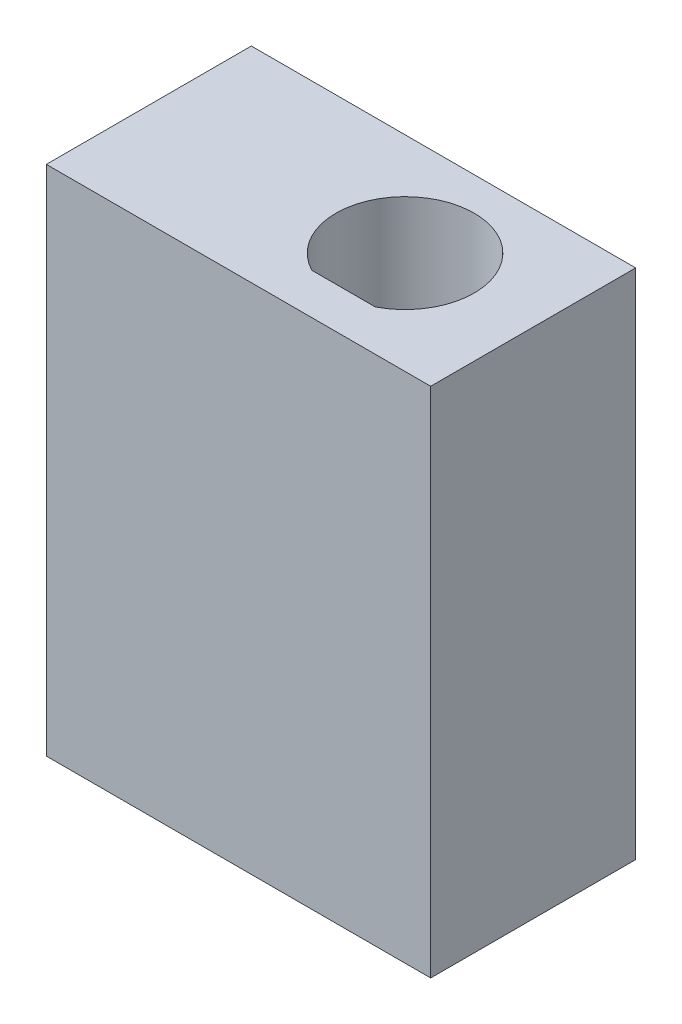
ISO-10303-21;
HEADER;
FILE_DESCRIPTION(('STEP AP214'),'2;1');
FILE_NAME('part.step','',(''),(''),'','','');
FILE_SCHEMA(('AUTOMOTIVE_DESIGN { 1 0 10303 214 1 1 1 1 }'));
ENDSEC;
DATA;
#1=APPLICATION_CONTEXT('core data for automotive mechanical design processes');
#2=APPLICATION_PROTOCOL_DEFINITION('international standard','automotive_design',2000,#1);
#3=PRODUCT_CONTEXT('',#1,'mechanical');
#4=PRODUCT('Part','Part','',(#3));
#5=PRODUCT_RELATED_PRODUCT_CATEGORY('part','',(#4));
#6=PRODUCT_DEFINITION_FORMATION('','',#4);
#7=PRODUCT_DEFINITION_CONTEXT('part definition',#1,'design');
#8=PRODUCT_DEFINITION('design','',#6,#7);
#9=PRODUCT_DEFINITION_SHAPE('','',#8);
#10=(LENGTH_UNIT() NAMED_UNIT(*) SI_UNIT(.MILLI.,.METRE.));
#11=(NAMED_UNIT(*) PLANE_ANGLE_UNIT() SI_UNIT($,.RADIAN.));
#12=(NAMED_UNIT(*) SI_UNIT($,.STERADIAN.) SOLID_ANGLE_UNIT());
#13=UNCERTAINTY_MEASURE_WITH_UNIT(LENGTH_MEASURE(1.E-05),#10,'distance_accuracy_value','');
#14=(GEOMETRIC_REPRESENTATION_CONTEXT(3) GLOBAL_UNCERTAINTY_ASSIGNED_CONTEXT((#13)) GLOBAL_UNIT_ASSIGNED_CONTEXT((#10,
#11,#12)) REPRESENTATION_CONTEXT('',''));
#15=CARTESIAN_POINT('',(0.,0.,0.));
#16=DIRECTION('',(0.,0.,1.));
#17=DIRECTION('',(1.,0.,0.));
#18=AXIS2_PLACEMENT_3D('',#15,#16,#17);
#19=CARTESIAN_POINT('',(0.,20.,0.));
#20=DIRECTION('',(0.,-1.,0.));
#21=DIRECTION('',(0.,0.,-1.));
#22=AXIS2_PLACEMENT_3D('',#19,#20,#21);
#23=PLANE('',#22);
#24=DIRECTION('',(0.,0.,1.));
#25=VECTOR('',#24,1.);
#26=CARTESIAN_POINT('',(0.,20.,0.));
#27=LINE('',#26,#25);
#28=CARTESIAN_POINT('',(0.,20.,-8.));
#29=VERTEX_POINT('',#28);
#30=CARTESIAN_POINT('',(0.,20.,0.));
#31=VERTEX_POINT('',#30);
#32=EDGE_CURVE('E115',#29,#31,#27,.T.);
#33=ORIENTED_EDGE('',*,*,#32,.T.);
#34=DIRECTION('',(1.,0.,0.));
#35=VECTOR('',#34,1.);
#36=CARTESIAN_POINT('',(0.,20.,0.));
#37=LINE('',#36,#35);
#38=CARTESIAN_POINT('',(15.,20.,0.));
#39=VERTEX_POINT('',#38);
#40=EDGE_CURVE('E119',#31,#39,#37,.T.);
#41=ORIENTED_EDGE('',*,*,#40,.T.);
#42=DIRECTION('',(0.,0.,-1.));
#43=VECTOR('',#42,1.);
#44=CARTESIAN_POINT('',(15.,20.,0.));
#45=LINE('',#44,#43);
#46=CARTESIAN_POINT('',(15.,20.,-8.));
#47=VERTEX_POINT('',#46);
#48=EDGE_CURVE('E123',#39,#47,#45,.T.);
#49=ORIENTED_EDGE('',*,*,#48,.T.);
#50=DIRECTION('',(-1.,0.,0.));
#51=VECTOR('',#50,1.);
#52=CARTESIAN_POINT('',(0.,20.,-8.));
#53=LINE('',#52,#51);
#54=EDGE_CURVE('E126',#47,#29,#53,.T.);
#55=ORIENTED_EDGE('',*,*,#54,.T.);
#56=EDGE_LOOP('',(#33,#41,#49,#55));
#57=FACE_BOUND('',#56,.T.);
#58=CARTESIAN_POINT('',(10.,20.,-4.));
#59=DIRECTION('',(0.,1.,0.));
#60=DIRECTION('',(0.,0.,1.));
#61=AXIS2_PLACEMENT_3D('',#58,#59,#60);
#62=CIRCLE('',#61,2.7);
#63=CARTESIAN_POINT('',(11.2369316876853,20.,-1.6));
#64=VERTEX_POINT('',#63);
#65=CARTESIAN_POINT('',(8.7630683123147,20.,-1.6));
#66=VERTEX_POINT('',#65);
#67=EDGE_CURVE('E99',#64,#66,#62,.T.);
#68=ORIENTED_EDGE('',*,*,#67,.F.);
#69=DIRECTION('',(1.,0.,0.));
#70=VECTOR('',#69,1.);
#71=CARTESIAN_POINT('',(8.7630683123147,20.,-1.6));
#72=LINE('',#71,#70);
#73=EDGE_CURVE('E92',#66,#64,#72,.T.);
#74=ORIENTED_EDGE('',*,*,#73,.F.);
#75=EDGE_LOOP('',(#68,#74));
#76=FACE_BOUND('',#75,.T.);
#77=ADVANCED_FACE('F39',(#57,#76),#23,.F.);
#78=CARTESIAN_POINT('',(0.,0.,0.));
#79=DIRECTION('',(0.,-1.,0.));
#80=DIRECTION('',(0.,0.,-1.));
#81=AXIS2_PLACEMENT_3D('',#78,#79,#80);
#82=PLANE('',#81);
#83=DIRECTION('',(0.,0.,1.));
#84=VECTOR('',#83,1.);
#85=CARTESIAN_POINT('',(0.,0.,0.));
#86=LINE('',#85,#84);
#87=CARTESIAN_POINT('',(0.,0.,-8.));
#88=VERTEX_POINT('',#87);
#89=CARTESIAN_POINT('',(0.,0.,0.));
#90=VERTEX_POINT('',#89);
#91=EDGE_CURVE('E114',#88,#90,#86,.T.);
#92=ORIENTED_EDGE('',*,*,#91,.F.);
#93=DIRECTION('',(-1.,0.,0.));
#94=VECTOR('',#93,1.);
#95=CARTESIAN_POINT('',(0.,0.,-8.));
#96=LINE('',#95,#94);
#97=CARTESIAN_POINT('',(15.,0.,-8.));
#98=VERTEX_POINT('',#97);
#99=EDGE_CURVE('E120',#98,#88,#96,.T.);
#100=ORIENTED_EDGE('',*,*,#99,.F.);
#101=DIRECTION('',(0.,0.,-1.));
#102=VECTOR('',#101,1.);
#103=CARTESIAN_POINT('',(15.,0.,0.));
#104=LINE('',#103,#102);
#105=CARTESIAN_POINT('',(15.,0.,0.));
#106=VERTEX_POINT('',#105);
#107=EDGE_CURVE('E136',#106,#98,#104,.T.);
#108=ORIENTED_EDGE('',*,*,#107,.F.);
#109=DIRECTION('',(1.,0.,0.));
#110=VECTOR('',#109,1.);
#111=CARTESIAN_POINT('',(0.,0.,0.));
#112=LINE('',#111,#110);
#113=EDGE_CURVE('E133',#90,#106,#112,.T.);
#114=ORIENTED_EDGE('',*,*,#113,.F.);
#115=EDGE_LOOP('',(#92,#100,#108,#114));
#116=FACE_BOUND('',#115,.T.);
#117=DIRECTION('',(1.,0.,0.));
#118=VECTOR('',#117,1.);
#119=CARTESIAN_POINT('',(8.7630683123147,0.,-1.6));
#120=LINE('',#119,#118);
#121=CARTESIAN_POINT('',(8.7630683123147,0.,-1.6));
#122=VERTEX_POINT('',#121);
#123=CARTESIAN_POINT('',(11.2369316876853,0.,-1.6));
#124=VERTEX_POINT('',#123);
#125=EDGE_CURVE('E105',#122,#124,#120,.T.);
#126=ORIENTED_EDGE('',*,*,#125,.T.);
#127=CARTESIAN_POINT('',(10.,0.,-4.));
#128=DIRECTION('',(0.,1.,0.));
#129=DIRECTION('',(0.,0.,1.));
#130=AXIS2_PLACEMENT_3D('',#127,#128,#129);
#131=CIRCLE('',#130,2.7);
#132=EDGE_CURVE('E62',#124,#122,#131,.T.);
#133=ORIENTED_EDGE('',*,*,#132,.T.);
#134=EDGE_LOOP('',(#126,#133));
#135=FACE_BOUND('',#134,.T.);
#136=ADVANCED_FACE('F159',(#116,#135),#82,.T.);
#137=CARTESIAN_POINT('',(0.,20.,0.));
#138=DIRECTION('',(1.,0.,0.));
#139=DIRECTION('',(0.,0.,-1.));
#140=AXIS2_PLACEMENT_3D('',#137,#138,#139);
#141=PLANE('',#140);
#142=ORIENTED_EDGE('',*,*,#91,.T.);
#143=DIRECTION('',(0.,-1.,0.));
#144=VECTOR('',#143,1.);
#145=CARTESIAN_POINT('',(0.,20.,0.));
#146=LINE('',#145,#144);
#147=EDGE_CURVE('E11',#31,#90,#146,.T.);
#148=ORIENTED_EDGE('',*,*,#147,.F.);
#149=ORIENTED_EDGE('',*,*,#32,.F.);
#150=DIRECTION('',(0.,-1.,0.));
#151=VECTOR('',#150,1.);
#152=CARTESIAN_POINT('',(0.,20.,-8.));
#153=LINE('',#152,#151);
#154=EDGE_CURVE('E129',#29,#88,#153,.T.);
#155=ORIENTED_EDGE('',*,*,#154,.T.);
#156=EDGE_LOOP('',(#142,#148,#149,#155));
#157=FACE_BOUND('',#156,.T.);
#158=ADVANCED_FACE('F41',(#157),#141,.F.);
#159=CARTESIAN_POINT('',(0.,20.,0.));
#160=DIRECTION('',(0.,0.,-1.));
#161=DIRECTION('',(-1.,0.,0.));
#162=AXIS2_PLACEMENT_3D('',#159,#160,#161);
#163=PLANE('',#162);
#164=ORIENTED_EDGE('',*,*,#113,.T.);
#165=DIRECTION('',(0.,-1.,0.));
#166=VECTOR('',#165,1.);
#167=CARTESIAN_POINT('',(15.,20.,0.));
#168=LINE('',#167,#166);
#169=EDGE_CURVE('E48',#39,#106,#168,.T.);
#170=ORIENTED_EDGE('',*,*,#169,.F.);
#171=ORIENTED_EDGE('',*,*,#40,.F.);
#172=ORIENTED_EDGE('',*,*,#147,.T.);
#173=EDGE_LOOP('',(#164,#170,#171,#172));
#174=FACE_BOUND('',#173,.T.);
#175=ADVANCED_FACE('F169',(#174),#163,.F.);
#176=CARTESIAN_POINT('',(15.,20.,0.));
#177=DIRECTION('',(-1.,0.,0.));
#178=DIRECTION('',(0.,0.,1.));
#179=AXIS2_PLACEMENT_3D('',#176,#177,#178);
#180=PLANE('',#179);
#181=ORIENTED_EDGE('',*,*,#107,.T.);
#182=DIRECTION('',(0.,-1.,0.));
#183=VECTOR('',#182,1.);
#184=CARTESIAN_POINT('',(15.,20.,-8.));
#185=LINE('',#184,#183);
#186=EDGE_CURVE('E144',#47,#98,#185,.T.);
#187=ORIENTED_EDGE('',*,*,#186,.F.);
#188=ORIENTED_EDGE('',*,*,#48,.F.);
#189=ORIENTED_EDGE('',*,*,#169,.T.);
#190=EDGE_LOOP('',(#181,#187,#188,#189));
#191=FACE_BOUND('',#190,.T.);
#192=ADVANCED_FACE('F153',(#191),#180,.F.);
#193=CARTESIAN_POINT('',(0.,20.,-8.));
#194=DIRECTION('',(0.,0.,1.));
#195=DIRECTION('',(1.,0.,0.));
#196=AXIS2_PLACEMENT_3D('',#193,#194,#195);
#197=PLANE('',#196);
#198=ORIENTED_EDGE('',*,*,#99,.T.);
#199=ORIENTED_EDGE('',*,*,#154,.F.);
#200=ORIENTED_EDGE('',*,*,#54,.F.);
#201=ORIENTED_EDGE('',*,*,#186,.T.);
#202=EDGE_LOOP('',(#198,#199,#200,#201));
#203=FACE_BOUND('',#202,.T.);
#204=ADVANCED_FACE('F163',(#203),#197,.F.);
#205=CARTESIAN_POINT('',(10.,20.,-4.));
#206=DIRECTION('',(0.,-1.,0.));
#207=DIRECTION('',(0.,0.,-1.));
#208=AXIS2_PLACEMENT_3D('',#205,#206,#207);
#209=CYLINDRICAL_SURFACE('',#208,2.7);
#210=ORIENTED_EDGE('',*,*,#132,.F.);
#211=DIRECTION('',(0.,-1.,0.));
#212=VECTOR('',#211,1.);
#213=CARTESIAN_POINT('',(11.2369316876853,20.,-1.6));
#214=LINE('',#213,#212);
#215=EDGE_CURVE('E94',#64,#124,#214,.T.);
#216=ORIENTED_EDGE('',*,*,#215,.F.);
#217=ORIENTED_EDGE('',*,*,#67,.T.);
#218=DIRECTION('',(0.,-1.,0.));
#219=VECTOR('',#218,1.);
#220=CARTESIAN_POINT('',(8.7630683123147,20.,-1.6));
#221=LINE('',#220,#219);
#222=EDGE_CURVE('E55',#66,#122,#221,.T.);
#223=ORIENTED_EDGE('',*,*,#222,.T.);
#224=EDGE_LOOP('',(#210,#216,#217,#223));
#225=FACE_BOUND('',#224,.T.);
#226=ADVANCED_FACE('F101',(#225),#209,.F.);
#227=CARTESIAN_POINT('',(8.7630683123147,20.,-1.6));
#228=DIRECTION('',(0.,0.,-1.));
#229=DIRECTION('',(-1.,0.,0.));
#230=AXIS2_PLACEMENT_3D('',#227,#228,#229);
#231=PLANE('',#230);
#232=ORIENTED_EDGE('',*,*,#125,.F.);
#233=ORIENTED_EDGE('',*,*,#222,.F.);
#234=ORIENTED_EDGE('',*,*,#73,.T.);
#235=ORIENTED_EDGE('',*,*,#215,.T.);
#236=EDGE_LOOP('',(#232,#233,#234,#235));
#237=FACE_BOUND('',#236,.T.);
#238=ADVANCED_FACE('F93',(#237),#231,.T.);
#239=CLOSED_SHELL('',(#77,#136,#158,#175,#192,#204,#226,#238));
#240=MANIFOLD_SOLID_BREP('B2',#239);
#241=ADVANCED_BREP_SHAPE_REPRESENTATION('',(#18,#240),#14);
#242=SHAPE_DEFINITION_REPRESENTATION(#9,#241);
ENDSEC;
END-ISO-10303-21;
